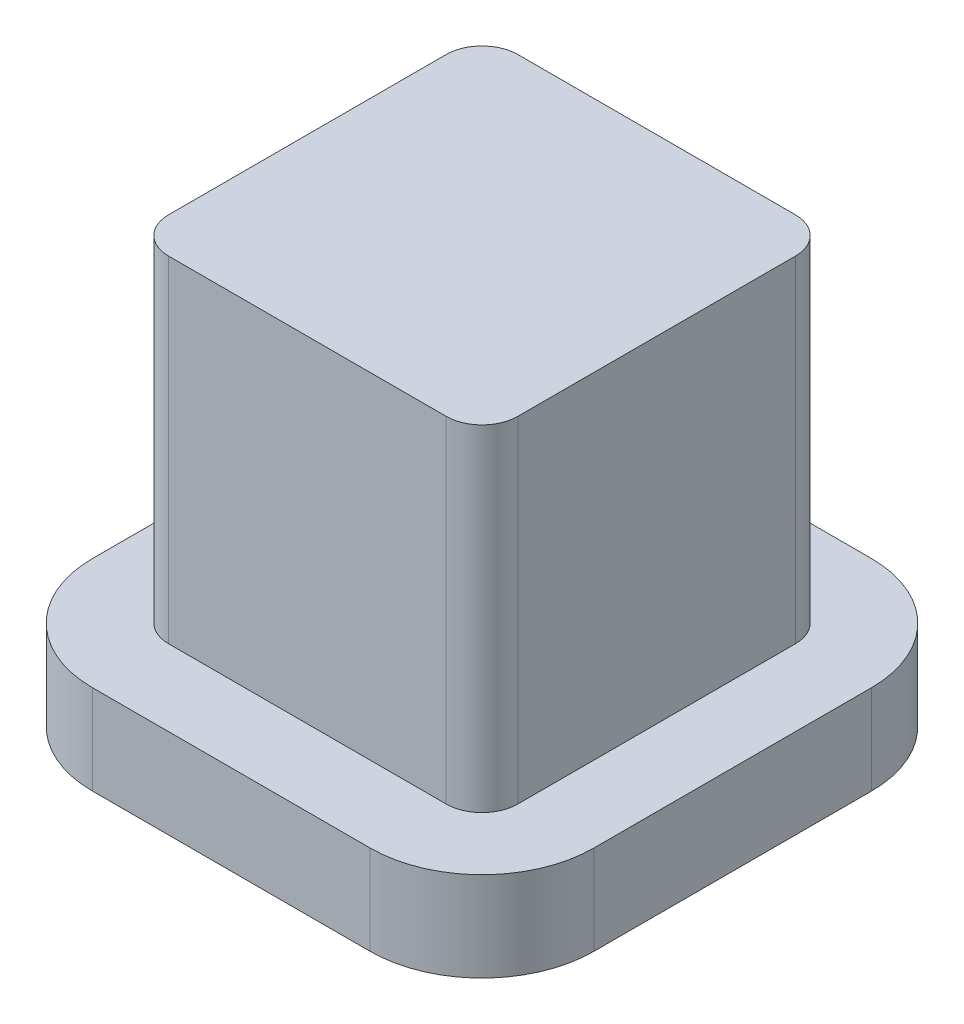
ISO-10303-21;
HEADER;
FILE_DESCRIPTION(('STEP AP214'),'2;1');
FILE_NAME('part.step','',(''),(''),'','','');
FILE_SCHEMA(('AUTOMOTIVE_DESIGN { 1 0 10303 214 1 1 1 1 }'));
ENDSEC;
DATA;
#1=APPLICATION_CONTEXT('core data for automotive mechanical design processes');
#2=APPLICATION_PROTOCOL_DEFINITION('international standard','automotive_design',2000,#1);
#3=PRODUCT_CONTEXT('',#1,'mechanical');
#4=PRODUCT('Part','Part','',(#3));
#5=PRODUCT_RELATED_PRODUCT_CATEGORY('part','',(#4));
#6=PRODUCT_DEFINITION_FORMATION('','',#4);
#7=PRODUCT_DEFINITION_CONTEXT('part definition',#1,'design');
#8=PRODUCT_DEFINITION('design','',#6,#7);
#9=PRODUCT_DEFINITION_SHAPE('','',#8);
#10=(LENGTH_UNIT() NAMED_UNIT(*) SI_UNIT(.MILLI.,.METRE.));
#11=(NAMED_UNIT(*) PLANE_ANGLE_UNIT() SI_UNIT($,.RADIAN.));
#12=(NAMED_UNIT(*) SI_UNIT($,.STERADIAN.) SOLID_ANGLE_UNIT());
#13=UNCERTAINTY_MEASURE_WITH_UNIT(LENGTH_MEASURE(1.E-05),#10,'distance_accuracy_value','');
#14=(GEOMETRIC_REPRESENTATION_CONTEXT(3) GLOBAL_UNCERTAINTY_ASSIGNED_CONTEXT((#13)) GLOBAL_UNIT_ASSIGNED_CONTEXT((#10,
#11,#12)) REPRESENTATION_CONTEXT('',''));
#15=CARTESIAN_POINT('',(0.,0.,0.));
#16=DIRECTION('',(0.,0.,1.));
#17=DIRECTION('',(1.,0.,0.));
#18=AXIS2_PLACEMENT_3D('',#15,#16,#17);
#19=CARTESIAN_POINT('',(81.7763790889018,130.224152421526,210.74612664294));
#20=DIRECTION('',(0.,-1.,0.));
#21=DIRECTION('',(0.,0.,-1.));
#22=AXIS2_PLACEMENT_3D('',#19,#20,#21);
#23=CYLINDRICAL_SURFACE('',#22,0.799999999999995);
#24=CARTESIAN_POINT('',(81.7763790889018,122.724152421526,210.74612664294));
#25=DIRECTION('',(0.,-1.,0.));
#26=DIRECTION('',(0.,0.,-1.));
#27=AXIS2_PLACEMENT_3D('',#24,#25,#26);
#28=CIRCLE('',#27,0.799999999999995);
#29=CARTESIAN_POINT('',(80.9763790889018,122.724152421526,210.74612664294));
#30=VERTEX_POINT('',#29);
#31=CARTESIAN_POINT('',(81.7763790889018,122.724152421526,209.94612664294));
#32=VERTEX_POINT('',#31);
#33=EDGE_CURVE('E143',#30,#32,#28,.T.);
#34=ORIENTED_EDGE('',*,*,#33,.F.);
#35=DIRECTION('',(0.,-1.,0.));
#36=VECTOR('',#35,1.);
#37=CARTESIAN_POINT('',(80.9763790889018,130.224152421526,210.74612664294));
#38=LINE('',#37,#36);
#39=CARTESIAN_POINT('',(80.9763790889018,130.224152421526,210.74612664294));
#40=VERTEX_POINT('',#39);
#41=EDGE_CURVE('E11',#40,#30,#38,.T.);
#42=ORIENTED_EDGE('',*,*,#41,.F.);
#43=CARTESIAN_POINT('',(81.7763790889018,130.224152421526,210.74612664294));
#44=DIRECTION('',(0.,-1.,0.));
#45=DIRECTION('',(0.,0.,-1.));
#46=AXIS2_PLACEMENT_3D('',#43,#44,#45);
#47=CIRCLE('',#46,0.799999999999995);
#48=CARTESIAN_POINT('',(81.7763790889018,130.224152421526,209.94612664294));
#49=VERTEX_POINT('',#48);
#50=EDGE_CURVE('E164',#40,#49,#47,.T.);
#51=ORIENTED_EDGE('',*,*,#50,.T.);
#52=DIRECTION('',(0.,-1.,0.));
#53=VECTOR('',#52,1.);
#54=CARTESIAN_POINT('',(81.7763790889018,130.224152421526,209.94612664294));
#55=LINE('',#54,#53);
#56=EDGE_CURVE('E40',#49,#32,#55,.T.);
#57=ORIENTED_EDGE('',*,*,#56,.T.);
#58=EDGE_LOOP('',(#34,#42,#51,#57));
#59=FACE_BOUND('',#58,.T.);
#60=ADVANCED_FACE('F37',(#59),#23,.T.);
#61=CARTESIAN_POINT('',(80.9763790889018,130.224152421526,210.74612664294));
#62=DIRECTION('',(-1.,0.,0.));
#63=DIRECTION('',(0.,0.,1.));
#64=AXIS2_PLACEMENT_3D('',#61,#62,#63);
#65=PLANE('',#64);
#66=DIRECTION('',(0.,0.,-1.));
#67=VECTOR('',#66,1.);
#68=CARTESIAN_POINT('',(80.9763790889018,122.724152421526,210.74612664294));
#69=LINE('',#68,#67);
#70=CARTESIAN_POINT('',(80.9763790889018,122.724152421526,216.94612664294));
#71=VERTEX_POINT('',#70);
#72=EDGE_CURVE('E162',#71,#30,#69,.T.);
#73=ORIENTED_EDGE('',*,*,#72,.F.);
#74=DIRECTION('',(0.,-1.,0.));
#75=VECTOR('',#74,1.);
#76=CARTESIAN_POINT('',(80.9763790889018,130.224152421526,216.94612664294));
#77=LINE('',#76,#75);
#78=CARTESIAN_POINT('',(80.9763790889018,130.224152421526,216.94612664294));
#79=VERTEX_POINT('',#78);
#80=EDGE_CURVE('E45',#79,#71,#77,.T.);
#81=ORIENTED_EDGE('',*,*,#80,.F.);
#82=DIRECTION('',(0.,0.,-1.));
#83=VECTOR('',#82,1.);
#84=CARTESIAN_POINT('',(80.9763790889018,130.224152421526,210.74612664294));
#85=LINE('',#84,#83);
#86=EDGE_CURVE('E133',#79,#40,#85,.T.);
#87=ORIENTED_EDGE('',*,*,#86,.T.);
#88=ORIENTED_EDGE('',*,*,#41,.T.);
#89=EDGE_LOOP('',(#73,#81,#87,#88));
#90=FACE_BOUND('',#89,.T.);
#91=ADVANCED_FACE('F178',(#90),#65,.T.);
#92=CARTESIAN_POINT('',(81.7763790889017,130.224152421526,216.94612664294));
#93=DIRECTION('',(0.,-1.,0.));
#94=DIRECTION('',(0.,0.,-1.));
#95=AXIS2_PLACEMENT_3D('',#92,#93,#94);
#96=CYLINDRICAL_SURFACE('',#95,0.799999999999988);
#97=CARTESIAN_POINT('',(81.7763790889017,122.724152421526,216.94612664294));
#98=DIRECTION('',(0.,-1.,0.));
#99=DIRECTION('',(0.,0.,-1.));
#100=AXIS2_PLACEMENT_3D('',#97,#98,#99);
#101=CIRCLE('',#100,0.799999999999988);
#102=CARTESIAN_POINT('',(81.7763790889017,122.724152421526,217.74612664294));
#103=VERTEX_POINT('',#102);
#104=EDGE_CURVE('E119',#103,#71,#101,.T.);
#105=ORIENTED_EDGE('',*,*,#104,.F.);
#106=DIRECTION('',(0.,-1.,0.));
#107=VECTOR('',#106,1.);
#108=CARTESIAN_POINT('',(81.7763790889017,130.224152421526,217.74612664294));
#109=LINE('',#108,#107);
#110=CARTESIAN_POINT('',(81.7763790889017,130.224152421526,217.74612664294));
#111=VERTEX_POINT('',#110);
#112=EDGE_CURVE('E113',#111,#103,#109,.T.);
#113=ORIENTED_EDGE('',*,*,#112,.F.);
#114=CARTESIAN_POINT('',(81.7763790889017,130.224152421526,216.94612664294));
#115=DIRECTION('',(0.,-1.,0.));
#116=DIRECTION('',(0.,0.,-1.));
#117=AXIS2_PLACEMENT_3D('',#114,#115,#116);
#118=CIRCLE('',#117,0.799999999999988);
#119=EDGE_CURVE('E116',#111,#79,#118,.T.);
#120=ORIENTED_EDGE('',*,*,#119,.T.);
#121=ORIENTED_EDGE('',*,*,#80,.T.);
#122=EDGE_LOOP('',(#105,#113,#120,#121));
#123=FACE_BOUND('',#122,.T.);
#124=ADVANCED_FACE('F115',(#123),#96,.T.);
#125=CARTESIAN_POINT('',(81.7763790889017,130.224152421526,217.74612664294));
#126=DIRECTION('',(0.,0.,1.));
#127=DIRECTION('',(1.,0.,0.));
#128=AXIS2_PLACEMENT_3D('',#125,#126,#127);
#129=PLANE('',#128);
#130=DIRECTION('',(-1.,0.,0.));
#131=VECTOR('',#130,1.);
#132=CARTESIAN_POINT('',(81.7763790889017,122.724152421526,217.74612664294));
#133=LINE('',#132,#131);
#134=CARTESIAN_POINT('',(87.9763790889018,122.724152421526,217.74612664294));
#135=VERTEX_POINT('',#134);
#136=EDGE_CURVE('E159',#135,#103,#133,.T.);
#137=ORIENTED_EDGE('',*,*,#136,.F.);
#138=DIRECTION('',(0.,-1.,0.));
#139=VECTOR('',#138,1.);
#140=CARTESIAN_POINT('',(87.9763790889018,130.224152421526,217.74612664294));
#141=LINE('',#140,#139);
#142=CARTESIAN_POINT('',(87.9763790889018,130.224152421526,217.74612664294));
#143=VERTEX_POINT('',#142);
#144=EDGE_CURVE('E124',#143,#135,#141,.T.);
#145=ORIENTED_EDGE('',*,*,#144,.F.);
#146=DIRECTION('',(-1.,0.,0.));
#147=VECTOR('',#146,1.);
#148=CARTESIAN_POINT('',(81.7763790889017,130.224152421526,217.74612664294));
#149=LINE('',#148,#147);
#150=EDGE_CURVE('E130',#143,#111,#149,.T.);
#151=ORIENTED_EDGE('',*,*,#150,.T.);
#152=ORIENTED_EDGE('',*,*,#112,.T.);
#153=EDGE_LOOP('',(#137,#145,#151,#152));
#154=FACE_BOUND('',#153,.T.);
#155=ADVANCED_FACE('F135',(#154),#129,.T.);
#156=CARTESIAN_POINT('',(87.9763790889018,130.224152421526,216.94612664294));
#157=DIRECTION('',(0.,-1.,0.));
#158=DIRECTION('',(0.,0.,-1.));
#159=AXIS2_PLACEMENT_3D('',#156,#157,#158);
#160=CYLINDRICAL_SURFACE('',#159,0.799999999999995);
#161=CARTESIAN_POINT('',(87.9763790889018,122.724152421526,216.94612664294));
#162=DIRECTION('',(0.,-1.,0.));
#163=DIRECTION('',(0.,0.,-1.));
#164=AXIS2_PLACEMENT_3D('',#161,#162,#163);
#165=CIRCLE('',#164,0.799999999999995);
#166=CARTESIAN_POINT('',(88.7763790889017,122.724152421526,216.94612664294));
#167=VERTEX_POINT('',#166);
#168=EDGE_CURVE('E156',#167,#135,#165,.T.);
#169=ORIENTED_EDGE('',*,*,#168,.F.);
#170=DIRECTION('',(0.,-1.,0.));
#171=VECTOR('',#170,1.);
#172=CARTESIAN_POINT('',(88.7763790889017,130.224152421526,216.94612664294));
#173=LINE('',#172,#171);
#174=CARTESIAN_POINT('',(88.7763790889017,130.224152421526,216.94612664294));
#175=VERTEX_POINT('',#174);
#176=EDGE_CURVE('E168',#175,#167,#173,.T.);
#177=ORIENTED_EDGE('',*,*,#176,.F.);
#178=CARTESIAN_POINT('',(87.9763790889018,130.224152421526,216.94612664294));
#179=DIRECTION('',(0.,-1.,0.));
#180=DIRECTION('',(0.,0.,-1.));
#181=AXIS2_PLACEMENT_3D('',#178,#179,#180);
#182=CIRCLE('',#181,0.799999999999995);
#183=EDGE_CURVE('E136',#175,#143,#182,.T.);
#184=ORIENTED_EDGE('',*,*,#183,.T.);
#185=ORIENTED_EDGE('',*,*,#144,.T.);
#186=EDGE_LOOP('',(#169,#177,#184,#185));
#187=FACE_BOUND('',#186,.T.);
#188=ADVANCED_FACE('F191',(#187),#160,.T.);
#189=CARTESIAN_POINT('',(88.7763790889017,130.224152421526,216.94612664294));
#190=DIRECTION('',(1.,0.,0.));
#191=DIRECTION('',(0.,0.,-1.));
#192=AXIS2_PLACEMENT_3D('',#189,#190,#191);
#193=PLANE('',#192);
#194=DIRECTION('',(0.,0.,1.));
#195=VECTOR('',#194,1.);
#196=CARTESIAN_POINT('',(88.7763790889017,122.724152421526,216.94612664294));
#197=LINE('',#196,#195);
#198=CARTESIAN_POINT('',(88.7763790889017,122.724152421526,210.74612664294));
#199=VERTEX_POINT('',#198);
#200=EDGE_CURVE('E153',#199,#167,#197,.T.);
#201=ORIENTED_EDGE('',*,*,#200,.F.);
#202=DIRECTION('',(0.,-1.,0.));
#203=VECTOR('',#202,1.);
#204=CARTESIAN_POINT('',(88.7763790889017,130.224152421526,210.74612664294));
#205=LINE('',#204,#203);
#206=CARTESIAN_POINT('',(88.7763790889017,130.224152421526,210.74612664294));
#207=VERTEX_POINT('',#206);
#208=EDGE_CURVE('E170',#207,#199,#205,.T.);
#209=ORIENTED_EDGE('',*,*,#208,.F.);
#210=DIRECTION('',(0.,0.,1.));
#211=VECTOR('',#210,1.);
#212=CARTESIAN_POINT('',(88.7763790889017,130.224152421526,216.94612664294));
#213=LINE('',#212,#211);
#214=EDGE_CURVE('E138',#207,#175,#213,.T.);
#215=ORIENTED_EDGE('',*,*,#214,.T.);
#216=ORIENTED_EDGE('',*,*,#176,.T.);
#217=EDGE_LOOP('',(#201,#209,#215,#216));
#218=FACE_BOUND('',#217,.T.);
#219=ADVANCED_FACE('F194',(#218),#193,.T.);
#220=CARTESIAN_POINT('',(87.9763790889017,130.224152421526,210.74612664294));
#221=DIRECTION('',(0.,-1.,0.));
#222=DIRECTION('',(0.,0.,-1.));
#223=AXIS2_PLACEMENT_3D('',#220,#221,#222);
#224=CYLINDRICAL_SURFACE('',#223,0.799999999999995);
#225=CARTESIAN_POINT('',(87.9763790889017,122.724152421526,210.74612664294));
#226=DIRECTION('',(0.,-1.,0.));
#227=DIRECTION('',(0.,0.,-1.));
#228=AXIS2_PLACEMENT_3D('',#225,#226,#227);
#229=CIRCLE('',#228,0.799999999999995);
#230=CARTESIAN_POINT('',(87.9763790889017,122.724152421526,209.94612664294));
#231=VERTEX_POINT('',#230);
#232=EDGE_CURVE('E150',#231,#199,#229,.T.);
#233=ORIENTED_EDGE('',*,*,#232,.F.);
#234=DIRECTION('',(0.,-1.,0.));
#235=VECTOR('',#234,1.);
#236=CARTESIAN_POINT('',(87.9763790889017,130.224152421526,209.94612664294));
#237=LINE('',#236,#235);
#238=CARTESIAN_POINT('',(87.9763790889017,130.224152421526,209.94612664294));
#239=VERTEX_POINT('',#238);
#240=EDGE_CURVE('E171',#239,#231,#237,.T.);
#241=ORIENTED_EDGE('',*,*,#240,.F.);
#242=CARTESIAN_POINT('',(87.9763790889017,130.224152421526,210.74612664294));
#243=DIRECTION('',(0.,-1.,0.));
#244=DIRECTION('',(0.,0.,-1.));
#245=AXIS2_PLACEMENT_3D('',#242,#243,#244);
#246=CIRCLE('',#245,0.799999999999995);
#247=EDGE_CURVE('E319',#239,#207,#246,.T.);
#248=ORIENTED_EDGE('',*,*,#247,.T.);
#249=ORIENTED_EDGE('',*,*,#208,.T.);
#250=EDGE_LOOP('',(#233,#241,#248,#249));
#251=FACE_BOUND('',#250,.T.);
#252=ADVANCED_FACE('F198',(#251),#224,.T.);
#253=CARTESIAN_POINT('',(87.9763790889017,130.224152421526,209.94612664294));
#254=DIRECTION('',(0.,0.,-1.));
#255=DIRECTION('',(-1.,0.,0.));
#256=AXIS2_PLACEMENT_3D('',#253,#254,#255);
#257=PLANE('',#256);
#258=DIRECTION('',(1.,0.,0.));
#259=VECTOR('',#258,1.);
#260=CARTESIAN_POINT('',(87.9763790889017,122.724152421526,209.94612664294));
#261=LINE('',#260,#259);
#262=EDGE_CURVE('E146',#32,#231,#261,.T.);
#263=ORIENTED_EDGE('',*,*,#262,.F.);
#264=ORIENTED_EDGE('',*,*,#56,.F.);
#265=DIRECTION('',(1.,0.,0.));
#266=VECTOR('',#265,1.);
#267=CARTESIAN_POINT('',(87.9763790889017,130.224152421526,209.94612664294));
#268=LINE('',#267,#266);
#269=EDGE_CURVE('E317',#49,#239,#268,.T.);
#270=ORIENTED_EDGE('',*,*,#269,.T.);
#271=ORIENTED_EDGE('',*,*,#240,.T.);
#272=EDGE_LOOP('',(#263,#264,#270,#271));
#273=FACE_BOUND('',#272,.T.);
#274=ADVANCED_FACE('F173',(#273),#257,.T.);
#275=CARTESIAN_POINT('',(81.7763790889018,130.224152421526,210.74612664294));
#276=DIRECTION('',(0.,-1.,0.));
#277=DIRECTION('',(0.,0.,-1.));
#278=AXIS2_PLACEMENT_3D('',#275,#276,#277);
#279=PLANE('',#278);
#280=ORIENTED_EDGE('',*,*,#50,.F.);
#281=ORIENTED_EDGE('',*,*,#86,.F.);
#282=ORIENTED_EDGE('',*,*,#119,.F.);
#283=ORIENTED_EDGE('',*,*,#150,.F.);
#284=ORIENTED_EDGE('',*,*,#183,.F.);
#285=ORIENTED_EDGE('',*,*,#214,.F.);
#286=ORIENTED_EDGE('',*,*,#247,.F.);
#287=ORIENTED_EDGE('',*,*,#269,.F.);
#288=EDGE_LOOP('',(#280,#281,#282,#283,#284,#285,#286,#287));
#289=FACE_BOUND('',#288,.T.);
#290=ADVANCED_FACE('F128',(#289),#279,.F.);
#291=CARTESIAN_POINT('',(81.7763790889018,122.724152421526,210.74612664294));
#292=DIRECTION('',(0.,-1.,0.));
#293=DIRECTION('',(0.,0.,-1.));
#294=AXIS2_PLACEMENT_3D('',#291,#292,#293);
#295=PLANE('',#294);
#296=CARTESIAN_POINT('',(81.7763790889018,122.724152421526,210.74612664294));
#297=DIRECTION('',(0.,-1.,0.));
#298=DIRECTION('',(0.,0.,-1.));
#299=AXIS2_PLACEMENT_3D('',#296,#297,#298);
#300=CIRCLE('',#299,2.5);
#301=CARTESIAN_POINT('',(79.2763790889017,122.724152421526,210.74612664294));
#302=VERTEX_POINT('',#301);
#303=CARTESIAN_POINT('',(81.7763790889018,122.724152421526,208.24612664294));
#304=VERTEX_POINT('',#303);
#305=EDGE_CURVE('E268',#302,#304,#300,.T.);
#306=ORIENTED_EDGE('',*,*,#305,.F.);
#307=DIRECTION('',(0.,0.,-1.));
#308=VECTOR('',#307,1.);
#309=CARTESIAN_POINT('',(79.2763790889017,122.724152421526,216.94612664294));
#310=LINE('',#309,#308);
#311=CARTESIAN_POINT('',(79.2763790889017,122.724152421526,216.94612664294));
#312=VERTEX_POINT('',#311);
#313=EDGE_CURVE('E294',#312,#302,#310,.T.);
#314=ORIENTED_EDGE('',*,*,#313,.F.);
#315=CARTESIAN_POINT('',(81.7763790889017,122.724152421526,216.94612664294));
#316=DIRECTION('',(0.,-1.,0.));
#317=DIRECTION('',(0.,0.,-1.));
#318=AXIS2_PLACEMENT_3D('',#315,#316,#317);
#319=CIRCLE('',#318,2.5);
#320=CARTESIAN_POINT('',(81.7763790889017,122.724152421526,219.44612664294));
#321=VERTEX_POINT('',#320);
#322=EDGE_CURVE('E291',#321,#312,#319,.T.);
#323=ORIENTED_EDGE('',*,*,#322,.F.);
#324=DIRECTION('',(-1.,0.,0.));
#325=VECTOR('',#324,1.);
#326=CARTESIAN_POINT('',(87.9763790889018,122.724152421526,219.44612664294));
#327=LINE('',#326,#325);
#328=CARTESIAN_POINT('',(87.9763790889018,122.724152421526,219.44612664294));
#329=VERTEX_POINT('',#328);
#330=EDGE_CURVE('E288',#329,#321,#327,.T.);
#331=ORIENTED_EDGE('',*,*,#330,.F.);
#332=CARTESIAN_POINT('',(87.9763790889018,122.724152421526,216.94612664294));
#333=DIRECTION('',(0.,-1.,0.));
#334=DIRECTION('',(0.,0.,-1.));
#335=AXIS2_PLACEMENT_3D('',#332,#333,#334);
#336=CIRCLE('',#335,2.5);
#337=CARTESIAN_POINT('',(90.4763790889017,122.724152421526,216.94612664294));
#338=VERTEX_POINT('',#337);
#339=EDGE_CURVE('E282',#338,#329,#336,.T.);
#340=ORIENTED_EDGE('',*,*,#339,.F.);
#341=DIRECTION('',(0.,0.,1.));
#342=VECTOR('',#341,1.);
#343=CARTESIAN_POINT('',(90.4763790889017,122.724152421526,210.74612664294));
#344=LINE('',#343,#342);
#345=CARTESIAN_POINT('',(90.4763790889017,122.724152421526,210.74612664294));
#346=VERTEX_POINT('',#345);
#347=EDGE_CURVE('E280',#346,#338,#344,.T.);
#348=ORIENTED_EDGE('',*,*,#347,.F.);
#349=CARTESIAN_POINT('',(87.9763790889017,122.724152421526,210.74612664294));
#350=DIRECTION('',(0.,-1.,0.));
#351=DIRECTION('',(0.,0.,-1.));
#352=AXIS2_PLACEMENT_3D('',#349,#350,#351);
#353=CIRCLE('',#352,2.5);
#354=CARTESIAN_POINT('',(87.9763790889017,122.724152421526,208.24612664294));
#355=VERTEX_POINT('',#354);
#356=EDGE_CURVE('E267',#355,#346,#353,.T.);
#357=ORIENTED_EDGE('',*,*,#356,.F.);
#358=DIRECTION('',(1.,0.,0.));
#359=VECTOR('',#358,1.);
#360=CARTESIAN_POINT('',(81.7763790889018,122.724152421526,208.24612664294));
#361=LINE('',#360,#359);
#362=EDGE_CURVE('E255',#304,#355,#361,.T.);
#363=ORIENTED_EDGE('',*,*,#362,.F.);
#364=EDGE_LOOP('',(#306,#314,#323,#331,#340,#348,#357,#363));
#365=FACE_BOUND('',#364,.T.);
#366=ORIENTED_EDGE('',*,*,#72,.T.);
#367=ORIENTED_EDGE('',*,*,#33,.T.);
#368=ORIENTED_EDGE('',*,*,#262,.T.);
#369=ORIENTED_EDGE('',*,*,#232,.T.);
#370=ORIENTED_EDGE('',*,*,#200,.T.);
#371=ORIENTED_EDGE('',*,*,#168,.T.);
#372=ORIENTED_EDGE('',*,*,#136,.T.);
#373=ORIENTED_EDGE('',*,*,#104,.T.);
#374=EDGE_LOOP('',(#366,#367,#368,#369,#370,#371,#372,#373));
#375=FACE_BOUND('',#374,.T.);
#376=ADVANCED_FACE('F175',(#365,#375),#295,.F.);
#377=CARTESIAN_POINT('',(81.7763790889018,120.724152421526,210.74612664294));
#378=DIRECTION('',(0.,1.,0.));
#379=DIRECTION('',(0.,0.,1.));
#380=AXIS2_PLACEMENT_3D('',#377,#378,#379);
#381=CYLINDRICAL_SURFACE('',#380,2.5);
#382=ORIENTED_EDGE('',*,*,#305,.T.);
#383=DIRECTION('',(0.,1.,0.));
#384=VECTOR('',#383,1.);
#385=CARTESIAN_POINT('',(81.7763790889018,120.724152421526,208.24612664294));
#386=LINE('',#385,#384);
#387=CARTESIAN_POINT('',(81.7763790889018,120.724152421526,208.24612664294));
#388=VERTEX_POINT('',#387);
#389=EDGE_CURVE('E147',#388,#304,#386,.T.);
#390=ORIENTED_EDGE('',*,*,#389,.F.);
#391=CARTESIAN_POINT('',(81.7763790889018,120.724152421526,210.74612664294));
#392=DIRECTION('',(0.,-1.,0.));
#393=DIRECTION('',(0.,0.,-1.));
#394=AXIS2_PLACEMENT_3D('',#391,#392,#393);
#395=CIRCLE('',#394,2.5);
#396=CARTESIAN_POINT('',(79.2763790889017,120.724152421526,210.74612664294));
#397=VERTEX_POINT('',#396);
#398=EDGE_CURVE('E297',#397,#388,#395,.T.);
#399=ORIENTED_EDGE('',*,*,#398,.F.);
#400=DIRECTION('',(0.,1.,0.));
#401=VECTOR('',#400,1.);
#402=CARTESIAN_POINT('',(79.2763790889017,120.724152421526,210.74612664294));
#403=LINE('',#402,#401);
#404=EDGE_CURVE('E298',#397,#302,#403,.T.);
#405=ORIENTED_EDGE('',*,*,#404,.T.);
#406=EDGE_LOOP('',(#382,#390,#399,#405));
#407=FACE_BOUND('',#406,.T.);
#408=ADVANCED_FACE('F209',(#407),#381,.T.);
#409=CARTESIAN_POINT('',(81.7763790889018,120.724152421526,208.24612664294));
#410=DIRECTION('',(0.,0.,1.));
#411=DIRECTION('',(1.,0.,0.));
#412=AXIS2_PLACEMENT_3D('',#409,#410,#411);
#413=PLANE('',#412);
#414=ORIENTED_EDGE('',*,*,#362,.T.);
#415=DIRECTION('',(0.,1.,0.));
#416=VECTOR('',#415,1.);
#417=CARTESIAN_POINT('',(87.9763790889017,120.724152421526,208.24612664294));
#418=LINE('',#417,#416);
#419=CARTESIAN_POINT('',(87.9763790889017,120.724152421526,208.24612664294));
#420=VERTEX_POINT('',#419);
#421=EDGE_CURVE('E259',#420,#355,#418,.T.);
#422=ORIENTED_EDGE('',*,*,#421,.F.);
#423=DIRECTION('',(1.,0.,0.));
#424=VECTOR('',#423,1.);
#425=CARTESIAN_POINT('',(81.7763790889018,120.724152421526,208.24612664294));
#426=LINE('',#425,#424);
#427=EDGE_CURVE('E364',#388,#420,#426,.T.);
#428=ORIENTED_EDGE('',*,*,#427,.F.);
#429=ORIENTED_EDGE('',*,*,#389,.T.);
#430=EDGE_LOOP('',(#414,#422,#428,#429));
#431=FACE_BOUND('',#430,.T.);
#432=ADVANCED_FACE('F215',(#431),#413,.F.);
#433=CARTESIAN_POINT('',(87.9763790889017,120.724152421526,210.74612664294));
#434=DIRECTION('',(0.,1.,0.));
#435=DIRECTION('',(0.,0.,1.));
#436=AXIS2_PLACEMENT_3D('',#433,#434,#435);
#437=CYLINDRICAL_SURFACE('',#436,2.5);
#438=ORIENTED_EDGE('',*,*,#356,.T.);
#439=DIRECTION('',(0.,1.,0.));
#440=VECTOR('',#439,1.);
#441=CARTESIAN_POINT('',(90.4763790889017,120.724152421526,210.74612664294));
#442=LINE('',#441,#440);
#443=CARTESIAN_POINT('',(90.4763790889017,120.724152421526,210.74612664294));
#444=VERTEX_POINT('',#443);
#445=EDGE_CURVE('E275',#444,#346,#442,.T.);
#446=ORIENTED_EDGE('',*,*,#445,.F.);
#447=CARTESIAN_POINT('',(87.9763790889017,120.724152421526,210.74612664294));
#448=DIRECTION('',(0.,-1.,0.));
#449=DIRECTION('',(0.,0.,-1.));
#450=AXIS2_PLACEMENT_3D('',#447,#448,#449);
#451=CIRCLE('',#450,2.5);
#452=EDGE_CURVE('E274',#420,#444,#451,.T.);
#453=ORIENTED_EDGE('',*,*,#452,.F.);
#454=ORIENTED_EDGE('',*,*,#421,.T.);
#455=EDGE_LOOP('',(#438,#446,#453,#454));
#456=FACE_BOUND('',#455,.T.);
#457=ADVANCED_FACE('F241',(#456),#437,.T.);
#458=CARTESIAN_POINT('',(90.4763790889017,120.724152421526,210.74612664294));
#459=DIRECTION('',(-1.,0.,0.));
#460=DIRECTION('',(0.,0.,1.));
#461=AXIS2_PLACEMENT_3D('',#458,#459,#460);
#462=PLANE('',#461);
#463=ORIENTED_EDGE('',*,*,#347,.T.);
#464=DIRECTION('',(0.,1.,0.));
#465=VECTOR('',#464,1.);
#466=CARTESIAN_POINT('',(90.4763790889017,120.724152421526,216.94612664294));
#467=LINE('',#466,#465);
#468=CARTESIAN_POINT('',(90.4763790889017,120.724152421526,216.94612664294));
#469=VERTEX_POINT('',#468);
#470=EDGE_CURVE('E311',#469,#338,#467,.T.);
#471=ORIENTED_EDGE('',*,*,#470,.F.);
#472=DIRECTION('',(0.,0.,1.));
#473=VECTOR('',#472,1.);
#474=CARTESIAN_POINT('',(90.4763790889017,120.724152421526,210.74612664294));
#475=LINE('',#474,#473);
#476=EDGE_CURVE('E331',#444,#469,#475,.T.);
#477=ORIENTED_EDGE('',*,*,#476,.F.);
#478=ORIENTED_EDGE('',*,*,#445,.T.);
#479=EDGE_LOOP('',(#463,#471,#477,#478));
#480=FACE_BOUND('',#479,.T.);
#481=ADVANCED_FACE('F237',(#480),#462,.F.);
#482=CARTESIAN_POINT('',(87.9763790889018,120.724152421526,216.94612664294));
#483=DIRECTION('',(0.,1.,0.));
#484=DIRECTION('',(0.,0.,1.));
#485=AXIS2_PLACEMENT_3D('',#482,#483,#484);
#486=CYLINDRICAL_SURFACE('',#485,2.5);
#487=ORIENTED_EDGE('',*,*,#339,.T.);
#488=DIRECTION('',(0.,1.,0.));
#489=VECTOR('',#488,1.);
#490=CARTESIAN_POINT('',(87.9763790889018,120.724152421526,219.44612664294));
#491=LINE('',#490,#489);
#492=CARTESIAN_POINT('',(87.9763790889018,120.724152421526,219.44612664294));
#493=VERTEX_POINT('',#492);
#494=EDGE_CURVE('E308',#493,#329,#491,.T.);
#495=ORIENTED_EDGE('',*,*,#494,.F.);
#496=CARTESIAN_POINT('',(87.9763790889018,120.724152421526,216.94612664294));
#497=DIRECTION('',(0.,-1.,0.));
#498=DIRECTION('',(0.,0.,-1.));
#499=AXIS2_PLACEMENT_3D('',#496,#497,#498);
#500=CIRCLE('',#499,2.5);
#501=EDGE_CURVE('E429',#469,#493,#500,.T.);
#502=ORIENTED_EDGE('',*,*,#501,.F.);
#503=ORIENTED_EDGE('',*,*,#470,.T.);
#504=EDGE_LOOP('',(#487,#495,#502,#503));
#505=FACE_BOUND('',#504,.T.);
#506=ADVANCED_FACE('F233',(#505),#486,.T.);
#507=CARTESIAN_POINT('',(87.9763790889018,120.724152421526,219.44612664294));
#508=DIRECTION('',(0.,0.,-1.));
#509=DIRECTION('',(-1.,0.,0.));
#510=AXIS2_PLACEMENT_3D('',#507,#508,#509);
#511=PLANE('',#510);
#512=ORIENTED_EDGE('',*,*,#330,.T.);
#513=DIRECTION('',(0.,1.,0.));
#514=VECTOR('',#513,1.);
#515=CARTESIAN_POINT('',(81.7763790889017,120.724152421526,219.44612664294));
#516=LINE('',#515,#514);
#517=CARTESIAN_POINT('',(81.7763790889017,120.724152421526,219.44612664294));
#518=VERTEX_POINT('',#517);
#519=EDGE_CURVE('E305',#518,#321,#516,.T.);
#520=ORIENTED_EDGE('',*,*,#519,.F.);
#521=DIRECTION('',(-1.,0.,0.));
#522=VECTOR('',#521,1.);
#523=CARTESIAN_POINT('',(87.9763790889018,120.724152421526,219.44612664294));
#524=LINE('',#523,#522);
#525=EDGE_CURVE('E431',#493,#518,#524,.T.);
#526=ORIENTED_EDGE('',*,*,#525,.F.);
#527=ORIENTED_EDGE('',*,*,#494,.T.);
#528=EDGE_LOOP('',(#512,#520,#526,#527));
#529=FACE_BOUND('',#528,.T.);
#530=ADVANCED_FACE('F229',(#529),#511,.F.);
#531=CARTESIAN_POINT('',(81.7763790889017,120.724152421526,216.94612664294));
#532=DIRECTION('',(0.,1.,0.));
#533=DIRECTION('',(0.,0.,1.));
#534=AXIS2_PLACEMENT_3D('',#531,#532,#533);
#535=CYLINDRICAL_SURFACE('',#534,2.5);
#536=ORIENTED_EDGE('',*,*,#322,.T.);
#537=DIRECTION('',(0.,1.,0.));
#538=VECTOR('',#537,1.);
#539=CARTESIAN_POINT('',(79.2763790889017,120.724152421526,216.94612664294));
#540=LINE('',#539,#538);
#541=CARTESIAN_POINT('',(79.2763790889017,120.724152421526,216.94612664294));
#542=VERTEX_POINT('',#541);
#543=EDGE_CURVE('E301',#542,#312,#540,.T.);
#544=ORIENTED_EDGE('',*,*,#543,.F.);
#545=CARTESIAN_POINT('',(81.7763790889017,120.724152421526,216.94612664294));
#546=DIRECTION('',(0.,-1.,0.));
#547=DIRECTION('',(0.,0.,-1.));
#548=AXIS2_PLACEMENT_3D('',#545,#546,#547);
#549=CIRCLE('',#548,2.5);
#550=EDGE_CURVE('E433',#518,#542,#549,.T.);
#551=ORIENTED_EDGE('',*,*,#550,.F.);
#552=ORIENTED_EDGE('',*,*,#519,.T.);
#553=EDGE_LOOP('',(#536,#544,#551,#552));
#554=FACE_BOUND('',#553,.T.);
#555=ADVANCED_FACE('F225',(#554),#535,.T.);
#556=CARTESIAN_POINT('',(79.2763790889017,120.724152421526,216.94612664294));
#557=DIRECTION('',(1.,0.,0.));
#558=DIRECTION('',(0.,0.,-1.));
#559=AXIS2_PLACEMENT_3D('',#556,#557,#558);
#560=PLANE('',#559);
#561=ORIENTED_EDGE('',*,*,#313,.T.);
#562=ORIENTED_EDGE('',*,*,#404,.F.);
#563=DIRECTION('',(0.,0.,-1.));
#564=VECTOR('',#563,1.);
#565=CARTESIAN_POINT('',(79.2763790889017,120.724152421526,216.94612664294));
#566=LINE('',#565,#564);
#567=EDGE_CURVE('E302',#542,#397,#566,.T.);
#568=ORIENTED_EDGE('',*,*,#567,.F.);
#569=ORIENTED_EDGE('',*,*,#543,.T.);
#570=EDGE_LOOP('',(#561,#562,#568,#569));
#571=FACE_BOUND('',#570,.T.);
#572=ADVANCED_FACE('F222',(#571),#560,.F.);
#573=CARTESIAN_POINT('',(81.7763790889018,120.724152421526,210.74612664294));
#574=DIRECTION('',(0.,-1.,0.));
#575=DIRECTION('',(0.,0.,-1.));
#576=AXIS2_PLACEMENT_3D('',#573,#574,#575);
#577=PLANE('',#576);
#578=DIRECTION('',(0.,0.,1.));
#579=VECTOR('',#578,1.);
#580=CARTESIAN_POINT('',(87.9763790889017,120.724152421526,210.74612664294));
#581=LINE('',#580,#579);
#582=CARTESIAN_POINT('',(87.9763790889017,120.724152421526,210.74612664294));
#583=VERTEX_POINT('',#582);
#584=CARTESIAN_POINT('',(87.9763790889017,120.724152421526,216.94612664294));
#585=VERTEX_POINT('',#584);
#586=EDGE_CURVE('E53',#583,#585,#581,.T.);
#587=ORIENTED_EDGE('',*,*,#586,.F.);
#588=DIRECTION('',(1.,0.,0.));
#589=VECTOR('',#588,1.);
#590=CARTESIAN_POINT('',(87.9763790889017,120.724152421526,210.74612664294));
#591=LINE('',#590,#589);
#592=CARTESIAN_POINT('',(81.7763790889018,120.724152421526,210.74612664294));
#593=VERTEX_POINT('',#592);
#594=EDGE_CURVE('E407',#593,#583,#591,.T.);
#595=ORIENTED_EDGE('',*,*,#594,.F.);
#596=DIRECTION('',(0.,0.,-1.));
#597=VECTOR('',#596,1.);
#598=CARTESIAN_POINT('',(81.7763790889018,120.724152421526,210.74612664294));
#599=LINE('',#598,#597);
#600=CARTESIAN_POINT('',(81.7763790889018,120.724152421526,216.94612664294));
#601=VERTEX_POINT('',#600);
#602=EDGE_CURVE('E410',#601,#593,#599,.T.);
#603=ORIENTED_EDGE('',*,*,#602,.F.);
#604=DIRECTION('',(-1.,0.,0.));
#605=VECTOR('',#604,1.);
#606=CARTESIAN_POINT('',(87.9763790889017,120.724152421526,216.94612664294));
#607=LINE('',#606,#605);
#608=EDGE_CURVE('E416',#585,#601,#607,.T.);
#609=ORIENTED_EDGE('',*,*,#608,.F.);
#610=EDGE_LOOP('',(#587,#595,#603,#609));
#611=FACE_BOUND('',#610,.T.);
#612=ORIENTED_EDGE('',*,*,#398,.T.);
#613=ORIENTED_EDGE('',*,*,#427,.T.);
#614=ORIENTED_EDGE('',*,*,#452,.T.);
#615=ORIENTED_EDGE('',*,*,#476,.T.);
#616=ORIENTED_EDGE('',*,*,#501,.T.);
#617=ORIENTED_EDGE('',*,*,#525,.T.);
#618=ORIENTED_EDGE('',*,*,#550,.T.);
#619=ORIENTED_EDGE('',*,*,#567,.T.);
#620=EDGE_LOOP('',(#612,#613,#614,#615,#616,#617,#618,#619));
#621=FACE_BOUND('',#620,.T.);
#622=ADVANCED_FACE('F220',(#611,#621),#577,.T.);
#623=CARTESIAN_POINT('',(87.9763790889017,125.124152421526,210.74612664294));
#624=DIRECTION('',(1.,0.,0.));
#625=DIRECTION('',(0.,0.,-1.));
#626=AXIS2_PLACEMENT_3D('',#623,#624,#625);
#627=PLANE('',#626);
#628=ORIENTED_EDGE('',*,*,#586,.T.);
#629=DIRECTION('',(0.,-1.,0.));
#630=VECTOR('',#629,1.);
#631=CARTESIAN_POINT('',(87.9763790889017,125.124152421526,216.94612664294));
#632=LINE('',#631,#630);
#633=CARTESIAN_POINT('',(87.9763790889017,125.124152421526,216.94612664294));
#634=VERTEX_POINT('',#633);
#635=EDGE_CURVE('E385',#634,#585,#632,.T.);
#636=ORIENTED_EDGE('',*,*,#635,.F.);
#637=DIRECTION('',(0.,0.,1.));
#638=VECTOR('',#637,1.);
#639=CARTESIAN_POINT('',(87.9763790889017,125.124152421526,210.74612664294));
#640=LINE('',#639,#638);
#641=CARTESIAN_POINT('',(87.9763790889017,125.124152421526,210.74612664294));
#642=VERTEX_POINT('',#641);
#643=EDGE_CURVE('E389',#642,#634,#640,.T.);
#644=ORIENTED_EDGE('',*,*,#643,.F.);
#645=DIRECTION('',(0.,-1.,0.));
#646=VECTOR('',#645,1.);
#647=CARTESIAN_POINT('',(87.9763790889017,125.124152421526,210.74612664294));
#648=LINE('',#647,#646);
#649=EDGE_CURVE('E420',#642,#583,#648,.T.);
#650=ORIENTED_EDGE('',*,*,#649,.T.);
#651=EDGE_LOOP('',(#628,#636,#644,#650));
#652=FACE_BOUND('',#651,.T.);
#653=ADVANCED_FACE('F387',(#652),#627,.F.);
#654=CARTESIAN_POINT('',(87.9763790889017,125.124152421526,210.74612664294));
#655=DIRECTION('',(0.,0.,-1.));
#656=DIRECTION('',(-1.,0.,0.));
#657=AXIS2_PLACEMENT_3D('',#654,#655,#656);
#658=PLANE('',#657);
#659=ORIENTED_EDGE('',*,*,#594,.T.);
#660=ORIENTED_EDGE('',*,*,#649,.F.);
#661=DIRECTION('',(1.,0.,0.));
#662=VECTOR('',#661,1.);
#663=CARTESIAN_POINT('',(87.9763790889017,125.124152421526,210.74612664294));
#664=LINE('',#663,#662);
#665=CARTESIAN_POINT('',(81.7763790889018,125.124152421526,210.74612664294));
#666=VERTEX_POINT('',#665);
#667=EDGE_CURVE('E395',#666,#642,#664,.T.);
#668=ORIENTED_EDGE('',*,*,#667,.F.);
#669=DIRECTION('',(0.,-1.,0.));
#670=VECTOR('',#669,1.);
#671=CARTESIAN_POINT('',(81.7763790889018,125.124152421526,210.74612664294));
#672=LINE('',#671,#670);
#673=EDGE_CURVE('E422',#666,#593,#672,.T.);
#674=ORIENTED_EDGE('',*,*,#673,.T.);
#675=EDGE_LOOP('',(#659,#660,#668,#674));
#676=FACE_BOUND('',#675,.T.);
#677=ADVANCED_FACE('F450',(#676),#658,.F.);
#678=CARTESIAN_POINT('',(81.7763790889018,125.124152421526,210.74612664294));
#679=DIRECTION('',(-1.,0.,0.));
#680=DIRECTION('',(0.,0.,1.));
#681=AXIS2_PLACEMENT_3D('',#678,#679,#680);
#682=PLANE('',#681);
#683=ORIENTED_EDGE('',*,*,#602,.T.);
#684=ORIENTED_EDGE('',*,*,#673,.F.);
#685=DIRECTION('',(0.,0.,-1.));
#686=VECTOR('',#685,1.);
#687=CARTESIAN_POINT('',(81.7763790889018,125.124152421526,210.74612664294));
#688=LINE('',#687,#686);
#689=CARTESIAN_POINT('',(81.7763790889018,125.124152421526,216.94612664294));
#690=VERTEX_POINT('',#689);
#691=EDGE_CURVE('E403',#690,#666,#688,.T.);
#692=ORIENTED_EDGE('',*,*,#691,.F.);
#693=DIRECTION('',(0.,-1.,0.));
#694=VECTOR('',#693,1.);
#695=CARTESIAN_POINT('',(81.7763790889018,125.124152421526,216.94612664294));
#696=LINE('',#695,#694);
#697=EDGE_CURVE('E394',#690,#601,#696,.T.);
#698=ORIENTED_EDGE('',*,*,#697,.T.);
#699=EDGE_LOOP('',(#683,#684,#692,#698));
#700=FACE_BOUND('',#699,.T.);
#701=ADVANCED_FACE('F454',(#700),#682,.F.);
#702=CARTESIAN_POINT('',(87.9763790889017,125.124152421526,216.94612664294));
#703=DIRECTION('',(0.,0.,1.));
#704=DIRECTION('',(1.,0.,0.));
#705=AXIS2_PLACEMENT_3D('',#702,#703,#704);
#706=PLANE('',#705);
#707=ORIENTED_EDGE('',*,*,#608,.T.);
#708=ORIENTED_EDGE('',*,*,#697,.F.);
#709=DIRECTION('',(-1.,0.,0.));
#710=VECTOR('',#709,1.);
#711=CARTESIAN_POINT('',(87.9763790889017,125.124152421526,216.94612664294));
#712=LINE('',#711,#710);
#713=EDGE_CURVE('E398',#634,#690,#712,.T.);
#714=ORIENTED_EDGE('',*,*,#713,.F.);
#715=ORIENTED_EDGE('',*,*,#635,.T.);
#716=EDGE_LOOP('',(#707,#708,#714,#715));
#717=FACE_BOUND('',#716,.T.);
#718=ADVANCED_FACE('F399',(#717),#706,.F.);
#719=CARTESIAN_POINT('',(0.,125.124152421526,0.));
#720=DIRECTION('',(0.,-1.,0.));
#721=DIRECTION('',(0.,0.,-1.));
#722=AXIS2_PLACEMENT_3D('',#719,#720,#721);
#723=PLANE('',#722);
#724=ORIENTED_EDGE('',*,*,#643,.T.);
#725=ORIENTED_EDGE('',*,*,#713,.T.);
#726=ORIENTED_EDGE('',*,*,#691,.T.);
#727=ORIENTED_EDGE('',*,*,#667,.T.);
#728=EDGE_LOOP('',(#724,#725,#726,#727));
#729=FACE_BOUND('',#728,.T.);
#730=ADVANCED_FACE('F405',(#729),#723,.T.);
#731=CLOSED_SHELL('',(#60,#91,#124,#155,#188,#219,#252,#274,#290,#376,#408,#432,#457,#481,#506,
#530,#555,#572,#622,#653,#677,#701,#718,#730));
#732=MANIFOLD_SOLID_BREP('B2',#731);
#733=ADVANCED_BREP_SHAPE_REPRESENTATION('',(#18,#732),#14);
#734=SHAPE_DEFINITION_REPRESENTATION(#9,#733);
ENDSEC;
END-ISO-10303-21;
